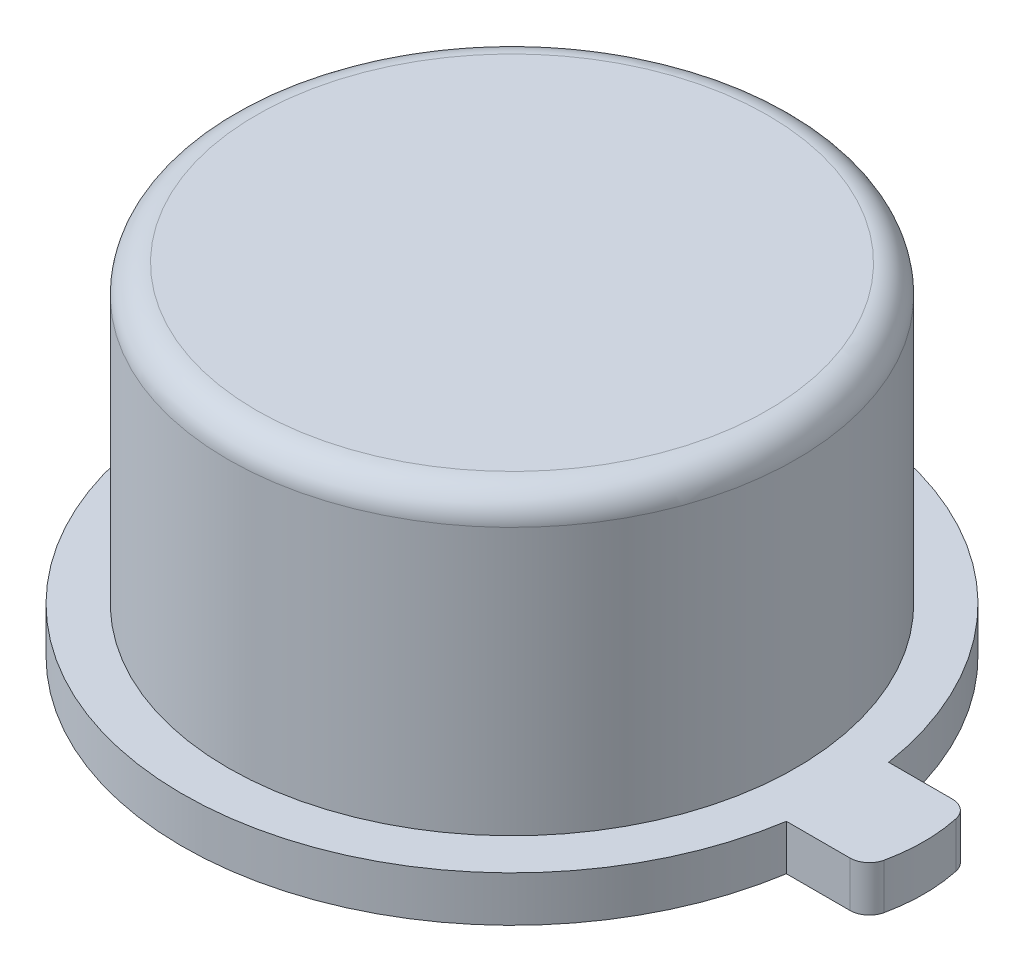
ISO-10303-21;
HEADER;
FILE_DESCRIPTION(('STEP AP214'),'2;1');
FILE_NAME('part.step','',(''),(''),'','','');
FILE_SCHEMA(('AUTOMOTIVE_DESIGN { 1 0 10303 214 1 1 1 1 }'));
ENDSEC;
DATA;
#1=APPLICATION_CONTEXT('core data for automotive mechanical design processes');
#2=APPLICATION_PROTOCOL_DEFINITION('international standard','automotive_design',2000,#1);
#3=PRODUCT_CONTEXT('',#1,'mechanical');
#4=PRODUCT('Part','Part','',(#3));
#5=PRODUCT_RELATED_PRODUCT_CATEGORY('part','',(#4));
#6=PRODUCT_DEFINITION_FORMATION('','',#4);
#7=PRODUCT_DEFINITION_CONTEXT('part definition',#1,'design');
#8=PRODUCT_DEFINITION('design','',#6,#7);
#9=PRODUCT_DEFINITION_SHAPE('','',#8);
#10=(LENGTH_UNIT() NAMED_UNIT(*) SI_UNIT(.MILLI.,.METRE.));
#11=(NAMED_UNIT(*) PLANE_ANGLE_UNIT() SI_UNIT($,.RADIAN.));
#12=(NAMED_UNIT(*) SI_UNIT($,.STERADIAN.) SOLID_ANGLE_UNIT());
#13=UNCERTAINTY_MEASURE_WITH_UNIT(LENGTH_MEASURE(1.E-05),#10,'distance_accuracy_value','');
#14=(GEOMETRIC_REPRESENTATION_CONTEXT(3) GLOBAL_UNCERTAINTY_ASSIGNED_CONTEXT((#13)) GLOBAL_UNIT_ASSIGNED_CONTEXT((#10,
#11,#12)) REPRESENTATION_CONTEXT('',''));
#15=CARTESIAN_POINT('',(0.,0.,0.));
#16=DIRECTION('',(0.,0.,1.));
#17=DIRECTION('',(1.,0.,0.));
#18=AXIS2_PLACEMENT_3D('',#15,#16,#17);
#19=CARTESIAN_POINT('',(0.,5.,0.));
#20=DIRECTION('',(0.,-1.,0.));
#21=DIRECTION('',(0.,0.,-1.));
#22=AXIS2_PLACEMENT_3D('',#19,#20,#21);
#23=CYLINDRICAL_SURFACE('',#22,3.9);
#24=CARTESIAN_POINT('',(0.,0.,0.));
#25=DIRECTION('',(0.,-1.,0.));
#26=DIRECTION('',(0.,0.,-1.));
#27=AXIS2_PLACEMENT_3D('',#24,#25,#26);
#28=CIRCLE('',#27,3.9);
#29=CARTESIAN_POINT('',(0.,0.,-3.9));
#30=VERTEX_POINT('',#29);
#31=EDGE_CURVE('E386',#30,#30,#28,.T.);
#32=ORIENTED_EDGE('',*,*,#31,.T.);
#33=EDGE_LOOP('',(#32));
#34=FACE_BOUND('',#33,.T.);
#35=DIRECTION('',(0.,1.,0.));
#36=VECTOR('',#35,1.);
#37=CARTESIAN_POINT('',(-3.86781592116274,0.6,0.500000000000039));
#38=LINE('',#37,#36);
#39=CARTESIAN_POINT('',(-3.86781592116274,0.6,0.500000000000039));
#40=VERTEX_POINT('',#39);
#41=CARTESIAN_POINT('',(-3.86781592116274,5.,0.500000000000039));
#42=VERTEX_POINT('',#41);
#43=EDGE_CURVE('E380',#40,#42,#38,.T.);
#44=ORIENTED_EDGE('',*,*,#43,.T.);
#45=CARTESIAN_POINT('',(0.,5.,0.));
#46=DIRECTION('',(0.,-1.,0.));
#47=DIRECTION('',(0.,0.,-1.));
#48=AXIS2_PLACEMENT_3D('',#45,#46,#47);
#49=CIRCLE('',#48,3.9);
#50=CARTESIAN_POINT('',(-0.5,5.,3.86781592116274));
#51=VERTEX_POINT('',#50);
#52=EDGE_CURVE('E508',#51,#42,#49,.T.);
#53=ORIENTED_EDGE('',*,*,#52,.F.);
#54=DIRECTION('',(0.,1.,0.));
#55=VECTOR('',#54,1.);
#56=CARTESIAN_POINT('',(-0.5,0.6,3.86781592116274));
#57=LINE('',#56,#55);
#58=CARTESIAN_POINT('',(-0.5,0.6,3.86781592116274));
#59=VERTEX_POINT('',#58);
#60=EDGE_CURVE('E48',#59,#51,#57,.T.);
#61=ORIENTED_EDGE('',*,*,#60,.F.);
#62=CARTESIAN_POINT('',(0.,0.6,0.));
#63=DIRECTION('',(0.,-1.,0.));
#64=DIRECTION('',(0.,0.,1.));
#65=AXIS2_PLACEMENT_3D('',#62,#63,#64);
#66=CIRCLE('',#65,3.9);
#67=CARTESIAN_POINT('',(0.499999999999999,0.6,3.86781592116274));
#68=VERTEX_POINT('',#67);
#69=EDGE_CURVE('E304',#68,#59,#66,.T.);
#70=ORIENTED_EDGE('',*,*,#69,.F.);
#71=DIRECTION('',(0.,1.,0.));
#72=VECTOR('',#71,1.);
#73=CARTESIAN_POINT('',(0.499999999999999,0.6,3.86781592116274));
#74=LINE('',#73,#72);
#75=CARTESIAN_POINT('',(0.499999999999999,5.,3.86781592116274));
#76=VERTEX_POINT('',#75);
#77=EDGE_CURVE('E344',#68,#76,#74,.T.);
#78=ORIENTED_EDGE('',*,*,#77,.T.);
#79=CARTESIAN_POINT('',(3.86781592116274,5.,0.499999999999986));
#80=VERTEX_POINT('',#79);
#81=EDGE_CURVE('E390',#80,#76,#49,.T.);
#82=ORIENTED_EDGE('',*,*,#81,.F.);
#83=DIRECTION('',(0.,1.,0.));
#84=VECTOR('',#83,1.);
#85=CARTESIAN_POINT('',(3.86781592116274,0.6,0.499999999999986));
#86=LINE('',#85,#84);
#87=CARTESIAN_POINT('',(3.86781592116274,0.6,0.499999999999986));
#88=VERTEX_POINT('',#87);
#89=EDGE_CURVE('E353',#88,#80,#86,.T.);
#90=ORIENTED_EDGE('',*,*,#89,.F.);
#91=CARTESIAN_POINT('',(0.,0.6,0.));
#92=DIRECTION('',(0.,-1.,0.));
#93=DIRECTION('',(0.,0.,1.));
#94=AXIS2_PLACEMENT_3D('',#91,#92,#93);
#95=CIRCLE('',#94,3.9);
#96=CARTESIAN_POINT('',(3.86781592116274,0.6,-0.500000000000014));
#97=VERTEX_POINT('',#96);
#98=EDGE_CURVE('E292',#97,#88,#95,.T.);
#99=ORIENTED_EDGE('',*,*,#98,.F.);
#100=DIRECTION('',(0.,1.,0.));
#101=VECTOR('',#100,1.);
#102=CARTESIAN_POINT('',(3.86781592116274,0.6,-0.500000000000014));
#103=LINE('',#102,#101);
#104=CARTESIAN_POINT('',(3.86781592116274,5.,-0.500000000000014));
#105=VERTEX_POINT('',#104);
#106=EDGE_CURVE('E356',#97,#105,#103,.T.);
#107=ORIENTED_EDGE('',*,*,#106,.T.);
#108=CARTESIAN_POINT('',(0.499999999999973,5.,-3.86781592116275));
#109=VERTEX_POINT('',#108);
#110=EDGE_CURVE('E387',#109,#105,#49,.T.);
#111=ORIENTED_EDGE('',*,*,#110,.F.);
#112=DIRECTION('',(0.,1.,0.));
#113=VECTOR('',#112,1.);
#114=CARTESIAN_POINT('',(0.499999999999973,0.6,-3.86781592116275));
#115=LINE('',#114,#113);
#116=CARTESIAN_POINT('',(0.499999999999973,0.6,-3.86781592116275));
#117=VERTEX_POINT('',#116);
#118=EDGE_CURVE('E365',#117,#109,#115,.T.);
#119=ORIENTED_EDGE('',*,*,#118,.F.);
#120=CARTESIAN_POINT('',(0.,0.6,0.));
#121=DIRECTION('',(0.,-1.,0.));
#122=DIRECTION('',(0.,0.,1.));
#123=AXIS2_PLACEMENT_3D('',#120,#121,#122);
#124=CIRCLE('',#123,3.9);
#125=CARTESIAN_POINT('',(-0.500000000000025,0.6,-3.86781592116274));
#126=VERTEX_POINT('',#125);
#127=EDGE_CURVE('E280',#126,#117,#124,.T.);
#128=ORIENTED_EDGE('',*,*,#127,.F.);
#129=DIRECTION('',(0.,1.,0.));
#130=VECTOR('',#129,1.);
#131=CARTESIAN_POINT('',(-0.500000000000025,0.6,-3.86781592116274));
#132=LINE('',#131,#130);
#133=CARTESIAN_POINT('',(-0.500000000000025,5.,-3.86781592116274));
#134=VERTEX_POINT('',#133);
#135=EDGE_CURVE('E368',#126,#134,#132,.T.);
#136=ORIENTED_EDGE('',*,*,#135,.T.);
#137=CARTESIAN_POINT('',(-3.86781592116275,5.,-0.49999999999996));
#138=VERTEX_POINT('',#137);
#139=EDGE_CURVE('E391',#138,#134,#49,.T.);
#140=ORIENTED_EDGE('',*,*,#139,.F.);
#141=DIRECTION('',(0.,1.,0.));
#142=VECTOR('',#141,1.);
#143=CARTESIAN_POINT('',(-3.86781592116275,0.6,-0.49999999999996));
#144=LINE('',#143,#142);
#145=CARTESIAN_POINT('',(-3.86781592116275,0.6,-0.49999999999996));
#146=VERTEX_POINT('',#145);
#147=EDGE_CURVE('E377',#146,#138,#144,.T.);
#148=ORIENTED_EDGE('',*,*,#147,.F.);
#149=CARTESIAN_POINT('',(0.,0.6,0.));
#150=DIRECTION('',(0.,-1.,0.));
#151=DIRECTION('',(0.,0.,1.));
#152=AXIS2_PLACEMENT_3D('',#149,#150,#151);
#153=CIRCLE('',#152,3.9);
#154=EDGE_CURVE('E268',#40,#146,#153,.T.);
#155=ORIENTED_EDGE('',*,*,#154,.F.);
#156=EDGE_LOOP('',(#44,#53,#61,#70,#78,#82,#90,#99,#107,#111,#119,#128,#136,#140,#148,#155));
#157=FACE_BOUND('',#156,.T.);
#158=ADVANCED_FACE('F33',(#34,#157),#23,.F.);
#159=CARTESIAN_POINT('',(0.,5.,0.));
#160=DIRECTION('',(0.,-1.,0.));
#161=DIRECTION('',(0.,0.,-1.));
#162=AXIS2_PLACEMENT_3D('',#159,#160,#161);
#163=PLANE('',#162);
#164=CARTESIAN_POINT('',(0.,5.,0.));
#165=DIRECTION('',(0.,-1.,0.));
#166=DIRECTION('',(0.,0.,-1.));
#167=AXIS2_PLACEMENT_3D('',#164,#165,#166);
#168=CIRCLE('',#167,2.);
#169=CARTESIAN_POINT('',(-1.93649167310371,5.,-0.499999999999979));
#170=VERTEX_POINT('',#169);
#171=CARTESIAN_POINT('',(-0.500000000000014,5.,-1.93649167310371));
#172=VERTEX_POINT('',#171);
#173=EDGE_CURVE('E316',#170,#172,#168,.T.);
#174=ORIENTED_EDGE('',*,*,#173,.F.);
#175=DIRECTION('',(1.,0.,0.));
#176=VECTOR('',#175,1.);
#177=CARTESIAN_POINT('',(-1.93649167310371,5.,-0.49999999999998));
#178=LINE('',#177,#176);
#179=EDGE_CURVE('E313',#138,#170,#178,.T.);
#180=ORIENTED_EDGE('',*,*,#179,.F.);
#181=ORIENTED_EDGE('',*,*,#139,.T.);
#182=DIRECTION('',(0.,0.,-1.));
#183=VECTOR('',#182,1.);
#184=CARTESIAN_POINT('',(-0.500000000000014,5.,-1.93649167310371));
#185=LINE('',#184,#183);
#186=EDGE_CURVE('E319',#172,#134,#185,.T.);
#187=ORIENTED_EDGE('',*,*,#186,.F.);
#188=EDGE_LOOP('',(#174,#180,#181,#187));
#189=FACE_BOUND('',#188,.T.);
#190=ADVANCED_FACE('F176',(#189),#163,.T.);
#191=CARTESIAN_POINT('',(0.,5.,0.));
#192=DIRECTION('',(0.,-1.,0.));
#193=DIRECTION('',(0.,0.,-1.));
#194=AXIS2_PLACEMENT_3D('',#191,#192,#193);
#195=CIRCLE('',#194,2.);
#196=CARTESIAN_POINT('',(0.499999999999986,5.,-1.93649167310371));
#197=VERTEX_POINT('',#196);
#198=CARTESIAN_POINT('',(1.93649167310371,5.,-0.500000000000007));
#199=VERTEX_POINT('',#198);
#200=EDGE_CURVE('E325',#197,#199,#195,.T.);
#201=ORIENTED_EDGE('',*,*,#200,.F.);
#202=DIRECTION('',(0.,0.,1.));
#203=VECTOR('',#202,1.);
#204=CARTESIAN_POINT('',(0.499999999999986,5.,-1.93649167310371));
#205=LINE('',#204,#203);
#206=EDGE_CURVE('E322',#109,#197,#205,.T.);
#207=ORIENTED_EDGE('',*,*,#206,.F.);
#208=ORIENTED_EDGE('',*,*,#110,.T.);
#209=DIRECTION('',(1.,0.,0.));
#210=VECTOR('',#209,1.);
#211=CARTESIAN_POINT('',(1.93649167310371,5.,-0.500000000000007));
#212=LINE('',#211,#210);
#213=EDGE_CURVE('E328',#199,#105,#212,.T.);
#214=ORIENTED_EDGE('',*,*,#213,.F.);
#215=EDGE_LOOP('',(#201,#207,#208,#214));
#216=FACE_BOUND('',#215,.T.);
#217=ADVANCED_FACE('F181',(#216),#163,.T.);
#218=CARTESIAN_POINT('',(0.,5.,0.));
#219=DIRECTION('',(0.,-1.,0.));
#220=DIRECTION('',(0.,0.,-1.));
#221=AXIS2_PLACEMENT_3D('',#218,#219,#220);
#222=CIRCLE('',#221,2.);
#223=CARTESIAN_POINT('',(1.93649167310371,5.,0.499999999999993));
#224=VERTEX_POINT('',#223);
#225=CARTESIAN_POINT('',(0.5,5.,1.93649167310371));
#226=VERTEX_POINT('',#225);
#227=EDGE_CURVE('E334',#224,#226,#222,.T.);
#228=ORIENTED_EDGE('',*,*,#227,.F.);
#229=DIRECTION('',(-1.,0.,0.));
#230=VECTOR('',#229,1.);
#231=CARTESIAN_POINT('',(1.93649167310371,5.,0.499999999999993));
#232=LINE('',#231,#230);
#233=EDGE_CURVE('E331',#80,#224,#232,.T.);
#234=ORIENTED_EDGE('',*,*,#233,.F.);
#235=ORIENTED_EDGE('',*,*,#81,.T.);
#236=DIRECTION('',(0.,0.,1.));
#237=VECTOR('',#236,1.);
#238=CARTESIAN_POINT('',(0.5,5.,1.93649167310371));
#239=LINE('',#238,#237);
#240=EDGE_CURVE('E337',#226,#76,#239,.T.);
#241=ORIENTED_EDGE('',*,*,#240,.F.);
#242=EDGE_LOOP('',(#228,#234,#235,#241));
#243=FACE_BOUND('',#242,.T.);
#244=ADVANCED_FACE('F248',(#243),#163,.T.);
#245=CARTESIAN_POINT('',(0.,0.8,0.));
#246=DIRECTION('',(0.,1.,0.));
#247=DIRECTION('',(0.,0.,1.));
#248=AXIS2_PLACEMENT_3D('',#245,#246,#247);
#249=PLANE('',#248);
#250=CARTESIAN_POINT('',(0.,0.8,0.));
#251=DIRECTION('',(0.,1.,0.));
#252=DIRECTION('',(0.,0.,1.));
#253=AXIS2_PLACEMENT_3D('',#250,#251,#252);
#254=CIRCLE('',#253,5.8);
#255=CARTESIAN_POINT('',(5.72974694031072,0.8,-0.9));
#256=VERTEX_POINT('',#255);
#257=CARTESIAN_POINT('',(5.72974694031072,0.8,0.9));
#258=VERTEX_POINT('',#257);
#259=EDGE_CURVE('E144',#256,#258,#254,.T.);
#260=ORIENTED_EDGE('',*,*,#259,.T.);
#261=DIRECTION('',(1.,0.,0.));
#262=VECTOR('',#261,1.);
#263=CARTESIAN_POINT('',(5.72974694031072,0.8,0.9));
#264=LINE('',#263,#262);
#265=CARTESIAN_POINT('',(6.85,0.8,0.9));
#266=VERTEX_POINT('',#265);
#267=EDGE_CURVE('E93',#258,#266,#264,.T.);
#268=ORIENTED_EDGE('',*,*,#267,.T.);
#269=CARTESIAN_POINT('',(6.85,0.8,0.55952380952381));
#270=DIRECTION('',(0.,1.,0.));
#271=DIRECTION('',(0.,0.,1.));
#272=AXIS2_PLACEMENT_3D('',#269,#270,#271);
#273=CIRCLE('',#272,0.34047619047619);
#274=CARTESIAN_POINT('',(7.18285586392122,0.8,0.631154879140555));
#275=VERTEX_POINT('',#274);
#276=EDGE_CURVE('E111',#266,#275,#273,.T.);
#277=ORIENTED_EDGE('',*,*,#276,.T.);
#278=CARTESIAN_POINT('',(4.25,0.8,0.));
#279=DIRECTION('',(0.,1.,0.));
#280=DIRECTION('',(0.,0.,-1.));
#281=AXIS2_PLACEMENT_3D('',#278,#279,#280);
#282=CIRCLE('',#281,3.);
#283=CARTESIAN_POINT('',(7.18285586392122,0.8,-0.631154879140554));
#284=VERTEX_POINT('',#283);
#285=EDGE_CURVE('E103',#275,#284,#282,.T.);
#286=ORIENTED_EDGE('',*,*,#285,.T.);
#287=CARTESIAN_POINT('',(6.85,0.8,-0.559523809523809));
#288=DIRECTION('',(0.,1.,0.));
#289=DIRECTION('',(0.,0.,-1.));
#290=AXIS2_PLACEMENT_3D('',#287,#288,#289);
#291=CIRCLE('',#290,0.34047619047619);
#292=CARTESIAN_POINT('',(6.85,0.8,-0.9));
#293=VERTEX_POINT('',#292);
#294=EDGE_CURVE('E108',#284,#293,#291,.T.);
#295=ORIENTED_EDGE('',*,*,#294,.T.);
#296=DIRECTION('',(-1.,0.,0.));
#297=VECTOR('',#296,1.);
#298=CARTESIAN_POINT('',(5.72974694031072,0.8,-0.9));
#299=LINE('',#298,#297);
#300=EDGE_CURVE('E57',#293,#256,#299,.T.);
#301=ORIENTED_EDGE('',*,*,#300,.T.);
#302=EDGE_LOOP('',(#260,#268,#277,#286,#295,#301));
#303=FACE_BOUND('',#302,.T.);
#304=CARTESIAN_POINT('',(0.,0.8,0.));
#305=DIRECTION('',(0.,1.,0.));
#306=DIRECTION('',(0.,0.,1.));
#307=AXIS2_PLACEMENT_3D('',#304,#305,#306);
#308=CIRCLE('',#307,5.);
#309=CARTESIAN_POINT('',(0.,0.8,5.));
#310=VERTEX_POINT('',#309);
#311=EDGE_CURVE('E136',#310,#310,#308,.T.);
#312=ORIENTED_EDGE('',*,*,#311,.F.);
#313=EDGE_LOOP('',(#312));
#314=FACE_BOUND('',#313,.T.);
#315=ADVANCED_FACE('F105',(#303,#314),#249,.T.);
#316=CARTESIAN_POINT('',(0.,0.,0.));
#317=DIRECTION('',(0.,1.,0.));
#318=DIRECTION('',(0.,0.,1.));
#319=AXIS2_PLACEMENT_3D('',#316,#317,#318);
#320=PLANE('',#319);
#321=ORIENTED_EDGE('',*,*,#31,.F.);
#322=EDGE_LOOP('',(#321));
#323=FACE_BOUND('',#322,.T.);
#324=CARTESIAN_POINT('',(0.,0.,0.));
#325=DIRECTION('',(0.,1.,0.));
#326=DIRECTION('',(0.,0.,1.));
#327=AXIS2_PLACEMENT_3D('',#324,#325,#326);
#328=CIRCLE('',#327,5.8);
#329=CARTESIAN_POINT('',(5.72974694031072,0.,-0.9));
#330=VERTEX_POINT('',#329);
#331=CARTESIAN_POINT('',(5.72974694031072,0.,0.9));
#332=VERTEX_POINT('',#331);
#333=EDGE_CURVE('E132',#330,#332,#328,.T.);
#334=ORIENTED_EDGE('',*,*,#333,.F.);
#335=DIRECTION('',(-1.,0.,0.));
#336=VECTOR('',#335,1.);
#337=CARTESIAN_POINT('',(5.72974694031072,0.,-0.9));
#338=LINE('',#337,#336);
#339=CARTESIAN_POINT('',(6.85,0.,-0.9));
#340=VERTEX_POINT('',#339);
#341=EDGE_CURVE('E84',#340,#330,#338,.T.);
#342=ORIENTED_EDGE('',*,*,#341,.F.);
#343=CARTESIAN_POINT('',(6.85,0.,-0.559523809523809));
#344=DIRECTION('',(0.,1.,0.));
#345=DIRECTION('',(0.,0.,-1.));
#346=AXIS2_PLACEMENT_3D('',#343,#344,#345);
#347=CIRCLE('',#346,0.34047619047619);
#348=CARTESIAN_POINT('',(7.18285586392122,0.,-0.631154879140554));
#349=VERTEX_POINT('',#348);
#350=EDGE_CURVE('E141',#349,#340,#347,.T.);
#351=ORIENTED_EDGE('',*,*,#350,.F.);
#352=CARTESIAN_POINT('',(4.25,0.,0.));
#353=DIRECTION('',(0.,1.,0.));
#354=DIRECTION('',(0.,0.,-1.));
#355=AXIS2_PLACEMENT_3D('',#352,#353,#354);
#356=CIRCLE('',#355,3.);
#357=CARTESIAN_POINT('',(7.18285586392122,0.,0.631154879140555));
#358=VERTEX_POINT('',#357);
#359=EDGE_CURVE('E120',#358,#349,#356,.T.);
#360=ORIENTED_EDGE('',*,*,#359,.F.);
#361=CARTESIAN_POINT('',(6.85,0.,0.55952380952381));
#362=DIRECTION('',(0.,1.,0.));
#363=DIRECTION('',(0.,0.,1.));
#364=AXIS2_PLACEMENT_3D('',#361,#362,#363);
#365=CIRCLE('',#364,0.34047619047619);
#366=CARTESIAN_POINT('',(6.85,0.,0.9));
#367=VERTEX_POINT('',#366);
#368=EDGE_CURVE('E138',#367,#358,#365,.T.);
#369=ORIENTED_EDGE('',*,*,#368,.F.);
#370=DIRECTION('',(1.,0.,0.));
#371=VECTOR('',#370,1.);
#372=CARTESIAN_POINT('',(5.72974694031072,0.,0.9));
#373=LINE('',#372,#371);
#374=EDGE_CURVE('E135',#332,#367,#373,.T.);
#375=ORIENTED_EDGE('',*,*,#374,.F.);
#376=EDGE_LOOP('',(#334,#342,#351,#360,#369,#375));
#377=FACE_BOUND('',#376,.T.);
#378=ADVANCED_FACE('F404',(#323,#377),#320,.F.);
#379=CARTESIAN_POINT('',(0.,0.8,0.));
#380=DIRECTION('',(0.,-1.,0.));
#381=DIRECTION('',(0.,0.,-1.));
#382=AXIS2_PLACEMENT_3D('',#379,#380,#381);
#383=CYLINDRICAL_SURFACE('',#382,5.8);
#384=ORIENTED_EDGE('',*,*,#333,.T.);
#385=DIRECTION('',(0.,-1.,0.));
#386=VECTOR('',#385,1.);
#387=CARTESIAN_POINT('',(5.72974694031072,0.8,0.9));
#388=LINE('',#387,#386);
#389=EDGE_CURVE('E151',#258,#332,#388,.T.);
#390=ORIENTED_EDGE('',*,*,#389,.F.);
#391=ORIENTED_EDGE('',*,*,#259,.F.);
#392=DIRECTION('',(0.,-1.,0.));
#393=VECTOR('',#392,1.);
#394=CARTESIAN_POINT('',(5.72974694031072,0.8,-0.9));
#395=LINE('',#394,#393);
#396=EDGE_CURVE('E128',#256,#330,#395,.T.);
#397=ORIENTED_EDGE('',*,*,#396,.T.);
#398=EDGE_LOOP('',(#384,#390,#391,#397));
#399=FACE_BOUND('',#398,.T.);
#400=ADVANCED_FACE('F406',(#399),#383,.T.);
#401=CARTESIAN_POINT('',(5.72974694031072,0.8,0.9));
#402=DIRECTION('',(0.,0.,-1.));
#403=DIRECTION('',(-1.,0.,0.));
#404=AXIS2_PLACEMENT_3D('',#401,#402,#403);
#405=PLANE('',#404);
#406=ORIENTED_EDGE('',*,*,#374,.T.);
#407=DIRECTION('',(0.,-1.,0.));
#408=VECTOR('',#407,1.);
#409=CARTESIAN_POINT('',(6.85,0.8,0.9));
#410=LINE('',#409,#408);
#411=EDGE_CURVE('E148',#266,#367,#410,.T.);
#412=ORIENTED_EDGE('',*,*,#411,.F.);
#413=ORIENTED_EDGE('',*,*,#267,.F.);
#414=ORIENTED_EDGE('',*,*,#389,.T.);
#415=EDGE_LOOP('',(#406,#412,#413,#414));
#416=FACE_BOUND('',#415,.T.);
#417=ADVANCED_FACE('F398',(#416),#405,.F.);
#418=CARTESIAN_POINT('',(6.85,0.8,0.55952380952381));
#419=DIRECTION('',(0.,-1.,0.));
#420=DIRECTION('',(0.,0.,-1.));
#421=AXIS2_PLACEMENT_3D('',#418,#419,#420);
#422=CYLINDRICAL_SURFACE('',#421,0.34047619047619);
#423=ORIENTED_EDGE('',*,*,#368,.T.);
#424=DIRECTION('',(0.,-1.,0.));
#425=VECTOR('',#424,1.);
#426=CARTESIAN_POINT('',(7.18285586392122,0.8,0.631154879140555));
#427=LINE('',#426,#425);
#428=EDGE_CURVE('E123',#275,#358,#427,.T.);
#429=ORIENTED_EDGE('',*,*,#428,.F.);
#430=ORIENTED_EDGE('',*,*,#276,.F.);
#431=ORIENTED_EDGE('',*,*,#411,.T.);
#432=EDGE_LOOP('',(#423,#429,#430,#431));
#433=FACE_BOUND('',#432,.T.);
#434=ADVANCED_FACE('F401',(#433),#422,.T.);
#435=CARTESIAN_POINT('',(4.25,0.8,0.));
#436=DIRECTION('',(0.,-1.,0.));
#437=DIRECTION('',(0.,0.,-1.));
#438=AXIS2_PLACEMENT_3D('',#435,#436,#437);
#439=CYLINDRICAL_SURFACE('',#438,3.);
#440=ORIENTED_EDGE('',*,*,#359,.T.);
#441=DIRECTION('',(0.,-1.,0.));
#442=VECTOR('',#441,1.);
#443=CARTESIAN_POINT('',(7.18285586392122,0.8,-0.631154879140554));
#444=LINE('',#443,#442);
#445=EDGE_CURVE('E117',#284,#349,#444,.T.);
#446=ORIENTED_EDGE('',*,*,#445,.F.);
#447=ORIENTED_EDGE('',*,*,#285,.F.);
#448=ORIENTED_EDGE('',*,*,#428,.T.);
#449=EDGE_LOOP('',(#440,#446,#447,#448));
#450=FACE_BOUND('',#449,.T.);
#451=ADVANCED_FACE('F118',(#450),#439,.T.);
#452=CARTESIAN_POINT('',(6.85,0.8,-0.559523809523809));
#453=DIRECTION('',(0.,-1.,0.));
#454=DIRECTION('',(0.,0.,-1.));
#455=AXIS2_PLACEMENT_3D('',#452,#453,#454);
#456=CYLINDRICAL_SURFACE('',#455,0.34047619047619);
#457=ORIENTED_EDGE('',*,*,#350,.T.);
#458=DIRECTION('',(0.,-1.,0.));
#459=VECTOR('',#458,1.);
#460=CARTESIAN_POINT('',(6.85,0.8,-0.9));
#461=LINE('',#460,#459);
#462=EDGE_CURVE('E124',#293,#340,#461,.T.);
#463=ORIENTED_EDGE('',*,*,#462,.F.);
#464=ORIENTED_EDGE('',*,*,#294,.F.);
#465=ORIENTED_EDGE('',*,*,#445,.T.);
#466=EDGE_LOOP('',(#457,#463,#464,#465));
#467=FACE_BOUND('',#466,.T.);
#468=ADVANCED_FACE('F126',(#467),#456,.T.);
#469=CARTESIAN_POINT('',(5.72974694031072,0.8,-0.9));
#470=DIRECTION('',(0.,0.,1.));
#471=DIRECTION('',(1.,0.,0.));
#472=AXIS2_PLACEMENT_3D('',#469,#470,#471);
#473=PLANE('',#472);
#474=ORIENTED_EDGE('',*,*,#341,.T.);
#475=ORIENTED_EDGE('',*,*,#396,.F.);
#476=ORIENTED_EDGE('',*,*,#300,.F.);
#477=ORIENTED_EDGE('',*,*,#462,.T.);
#478=EDGE_LOOP('',(#474,#475,#476,#477));
#479=FACE_BOUND('',#478,.T.);
#480=ADVANCED_FACE('F172',(#479),#473,.F.);
#481=CARTESIAN_POINT('',(0.,6.,0.));
#482=DIRECTION('',(0.,-1.,0.));
#483=DIRECTION('',(0.,0.,-1.));
#484=AXIS2_PLACEMENT_3D('',#481,#482,#483);
#485=CYLINDRICAL_SURFACE('',#484,5.);
#486=CARTESIAN_POINT('',(0.,5.5,0.));
#487=DIRECTION('',(0.,1.,0.));
#488=DIRECTION('',(0.,0.,1.));
#489=AXIS2_PLACEMENT_3D('',#486,#487,#488);
#490=CIRCLE('',#489,5.);
#491=CARTESIAN_POINT('',(0.,5.5,5.));
#492=VERTEX_POINT('',#491);
#493=EDGE_CURVE('E41',#492,#492,#490,.F.);
#494=ORIENTED_EDGE('',*,*,#493,.T.);
#495=EDGE_LOOP('',(#494));
#496=FACE_BOUND('',#495,.T.);
#497=ORIENTED_EDGE('',*,*,#311,.T.);
#498=EDGE_LOOP('',(#497));
#499=FACE_BOUND('',#498,.T.);
#500=ADVANCED_FACE('F158',(#496,#499),#485,.T.);
#501=CARTESIAN_POINT('',(0.,6.,0.));
#502=DIRECTION('',(0.,1.,0.));
#503=DIRECTION('',(0.,0.,1.));
#504=AXIS2_PLACEMENT_3D('',#501,#502,#503);
#505=PLANE('',#504);
#506=CARTESIAN_POINT('',(0.,6.,0.));
#507=DIRECTION('',(0.,1.,0.));
#508=DIRECTION('',(0.,0.,1.));
#509=AXIS2_PLACEMENT_3D('',#506,#507,#508);
#510=CIRCLE('',#509,4.5);
#511=CARTESIAN_POINT('',(0.,6.,4.5));
#512=VERTEX_POINT('',#511);
#513=EDGE_CURVE('E153',#512,#512,#510,.T.);
#514=ORIENTED_EDGE('',*,*,#513,.T.);
#515=EDGE_LOOP('',(#514));
#516=FACE_BOUND('',#515,.T.);
#517=ADVANCED_FACE('F164',(#516),#505,.T.);
#518=CARTESIAN_POINT('',(0.,5.5,0.));
#519=DIRECTION('',(0.,1.,0.));
#520=DIRECTION('',(0.,0.,1.));
#521=AXIS2_PLACEMENT_3D('',#518,#519,#520);
#522=TOROIDAL_SURFACE('',#521,4.5,0.5);
#523=ORIENTED_EDGE('',*,*,#493,.F.);
#524=EDGE_LOOP('',(#523));
#525=FACE_BOUND('',#524,.T.);
#526=ORIENTED_EDGE('',*,*,#513,.F.);
#527=EDGE_LOOP('',(#526));
#528=FACE_BOUND('',#527,.T.);
#529=ADVANCED_FACE('F35',(#525,#528),#522,.T.);
#530=ORIENTED_EDGE('',*,*,#52,.T.);
#531=DIRECTION('',(-1.,0.,0.));
#532=VECTOR('',#531,1.);
#533=CARTESIAN_POINT('',(-1.9364916731037,5.,0.50000000000002));
#534=LINE('',#533,#532);
#535=CARTESIAN_POINT('',(-1.9364916731037,5.,0.50000000000002));
#536=VERTEX_POINT('',#535);
#537=EDGE_CURVE('E258',#536,#42,#534,.T.);
#538=ORIENTED_EDGE('',*,*,#537,.F.);
#539=CARTESIAN_POINT('',(0.,5.,0.));
#540=DIRECTION('',(0.,-1.,0.));
#541=DIRECTION('',(0.,0.,-1.));
#542=AXIS2_PLACEMENT_3D('',#539,#540,#541);
#543=CIRCLE('',#542,2.);
#544=CARTESIAN_POINT('',(-0.5,5.,1.93649167310371));
#545=VERTEX_POINT('',#544);
#546=EDGE_CURVE('E255',#545,#536,#543,.T.);
#547=ORIENTED_EDGE('',*,*,#546,.F.);
#548=DIRECTION('',(0.,0.,-1.));
#549=VECTOR('',#548,1.);
#550=CARTESIAN_POINT('',(-0.5,5.,1.93649167310371));
#551=LINE('',#550,#549);
#552=EDGE_CURVE('E265',#51,#545,#551,.T.);
#553=ORIENTED_EDGE('',*,*,#552,.F.);
#554=EDGE_LOOP('',(#530,#538,#547,#553));
#555=FACE_BOUND('',#554,.T.);
#556=ADVANCED_FACE('F163',(#555),#163,.T.);
#557=CARTESIAN_POINT('',(0.,0.6,0.));
#558=DIRECTION('',(0.,-1.,0.));
#559=DIRECTION('',(0.,0.,-1.));
#560=AXIS2_PLACEMENT_3D('',#557,#558,#559);
#561=PLANE('',#560);
#562=CARTESIAN_POINT('',(0.,0.6,0.));
#563=DIRECTION('',(0.,-1.,0.));
#564=DIRECTION('',(0.,0.,-1.));
#565=AXIS2_PLACEMENT_3D('',#562,#563,#564);
#566=CIRCLE('',#565,2.);
#567=CARTESIAN_POINT('',(-0.5,0.6,1.93649167310371));
#568=VERTEX_POINT('',#567);
#569=CARTESIAN_POINT('',(-1.9364916731037,0.6,0.50000000000002));
#570=VERTEX_POINT('',#569);
#571=EDGE_CURVE('E261',#568,#570,#566,.T.);
#572=ORIENTED_EDGE('',*,*,#571,.T.);
#573=DIRECTION('',(-1.,0.,0.));
#574=VECTOR('',#573,1.);
#575=CARTESIAN_POINT('',(-1.9364916731037,0.6,0.50000000000002));
#576=LINE('',#575,#574);
#577=EDGE_CURVE('E264',#570,#40,#576,.T.);
#578=ORIENTED_EDGE('',*,*,#577,.T.);
#579=ORIENTED_EDGE('',*,*,#154,.T.);
#580=DIRECTION('',(1.,0.,0.));
#581=VECTOR('',#580,1.);
#582=CARTESIAN_POINT('',(-1.93649167310371,0.6,-0.49999999999998));
#583=LINE('',#582,#581);
#584=CARTESIAN_POINT('',(-1.93649167310371,0.6,-0.499999999999979));
#585=VERTEX_POINT('',#584);
#586=EDGE_CURVE('E271',#146,#585,#583,.T.);
#587=ORIENTED_EDGE('',*,*,#586,.T.);
#588=CARTESIAN_POINT('',(0.,0.6,0.));
#589=DIRECTION('',(0.,-1.,0.));
#590=DIRECTION('',(0.,0.,-1.));
#591=AXIS2_PLACEMENT_3D('',#588,#589,#590);
#592=CIRCLE('',#591,2.);
#593=CARTESIAN_POINT('',(-0.500000000000014,0.6,-1.93649167310371));
#594=VERTEX_POINT('',#593);
#595=EDGE_CURVE('E274',#585,#594,#592,.T.);
#596=ORIENTED_EDGE('',*,*,#595,.T.);
#597=DIRECTION('',(0.,0.,-1.));
#598=VECTOR('',#597,1.);
#599=CARTESIAN_POINT('',(-0.500000000000014,0.6,-1.93649167310371));
#600=LINE('',#599,#598);
#601=EDGE_CURVE('E277',#594,#126,#600,.T.);
#602=ORIENTED_EDGE('',*,*,#601,.T.);
#603=ORIENTED_EDGE('',*,*,#127,.T.);
#604=DIRECTION('',(0.,0.,1.));
#605=VECTOR('',#604,1.);
#606=CARTESIAN_POINT('',(0.499999999999986,0.6,-1.93649167310371));
#607=LINE('',#606,#605);
#608=CARTESIAN_POINT('',(0.499999999999986,0.6,-1.93649167310371));
#609=VERTEX_POINT('',#608);
#610=EDGE_CURVE('E283',#117,#609,#607,.T.);
#611=ORIENTED_EDGE('',*,*,#610,.T.);
#612=CARTESIAN_POINT('',(0.,0.6,0.));
#613=DIRECTION('',(0.,-1.,0.));
#614=DIRECTION('',(0.,0.,-1.));
#615=AXIS2_PLACEMENT_3D('',#612,#613,#614);
#616=CIRCLE('',#615,2.);
#617=CARTESIAN_POINT('',(1.93649167310371,0.6,-0.500000000000007));
#618=VERTEX_POINT('',#617);
#619=EDGE_CURVE('E286',#609,#618,#616,.T.);
#620=ORIENTED_EDGE('',*,*,#619,.T.);
#621=DIRECTION('',(1.,0.,0.));
#622=VECTOR('',#621,1.);
#623=CARTESIAN_POINT('',(1.93649167310371,0.6,-0.500000000000007));
#624=LINE('',#623,#622);
#625=EDGE_CURVE('E289',#618,#97,#624,.T.);
#626=ORIENTED_EDGE('',*,*,#625,.T.);
#627=ORIENTED_EDGE('',*,*,#98,.T.);
#628=DIRECTION('',(-1.,0.,0.));
#629=VECTOR('',#628,1.);
#630=CARTESIAN_POINT('',(1.93649167310371,0.6,0.499999999999993));
#631=LINE('',#630,#629);
#632=CARTESIAN_POINT('',(1.93649167310371,0.6,0.499999999999993));
#633=VERTEX_POINT('',#632);
#634=EDGE_CURVE('E295',#88,#633,#631,.T.);
#635=ORIENTED_EDGE('',*,*,#634,.T.);
#636=CARTESIAN_POINT('',(0.,0.6,0.));
#637=DIRECTION('',(0.,-1.,0.));
#638=DIRECTION('',(0.,0.,-1.));
#639=AXIS2_PLACEMENT_3D('',#636,#637,#638);
#640=CIRCLE('',#639,2.);
#641=CARTESIAN_POINT('',(0.5,0.6,1.93649167310371));
#642=VERTEX_POINT('',#641);
#643=EDGE_CURVE('E298',#633,#642,#640,.T.);
#644=ORIENTED_EDGE('',*,*,#643,.T.);
#645=DIRECTION('',(0.,0.,1.));
#646=VECTOR('',#645,1.);
#647=CARTESIAN_POINT('',(0.5,0.6,1.93649167310371));
#648=LINE('',#647,#646);
#649=EDGE_CURVE('E301',#642,#68,#648,.T.);
#650=ORIENTED_EDGE('',*,*,#649,.T.);
#651=ORIENTED_EDGE('',*,*,#69,.T.);
#652=DIRECTION('',(0.,0.,-1.));
#653=VECTOR('',#652,1.);
#654=CARTESIAN_POINT('',(-0.5,0.6,1.93649167310371));
#655=LINE('',#654,#653);
#656=EDGE_CURVE('E307',#59,#568,#655,.T.);
#657=ORIENTED_EDGE('',*,*,#656,.T.);
#658=EDGE_LOOP('',(#572,#578,#579,#587,#596,#602,#603,#611,#620,#626,#627,#635,#644,#650,#651,#657));
#659=FACE_BOUND('',#658,.T.);
#660=CARTESIAN_POINT('',(0.,0.6,0.));
#661=DIRECTION('',(0.,-1.,0.));
#662=DIRECTION('',(0.,0.,-1.));
#663=AXIS2_PLACEMENT_3D('',#660,#661,#662);
#664=CIRCLE('',#663,0.85);
#665=CARTESIAN_POINT('',(0.,0.6,-0.85));
#666=VERTEX_POINT('',#665);
#667=EDGE_CURVE('E252',#666,#666,#664,.T.);
#668=ORIENTED_EDGE('',*,*,#667,.F.);
#669=EDGE_LOOP('',(#668));
#670=FACE_BOUND('',#669,.T.);
#671=ADVANCED_FACE('F188',(#659,#670),#561,.T.);
#672=CARTESIAN_POINT('',(0.,0.6,0.));
#673=DIRECTION('',(0.,1.,0.));
#674=DIRECTION('',(0.,0.,1.));
#675=AXIS2_PLACEMENT_3D('',#672,#673,#674);
#676=CYLINDRICAL_SURFACE('',#675,2.);
#677=ORIENTED_EDGE('',*,*,#546,.T.);
#678=DIRECTION('',(0.,1.,0.));
#679=VECTOR('',#678,1.);
#680=CARTESIAN_POINT('',(-1.9364916731037,0.6,0.50000000000002));
#681=LINE('',#680,#679);
#682=EDGE_CURVE('E383',#570,#536,#681,.T.);
#683=ORIENTED_EDGE('',*,*,#682,.F.);
#684=ORIENTED_EDGE('',*,*,#571,.F.);
#685=DIRECTION('',(0.,1.,0.));
#686=VECTOR('',#685,1.);
#687=CARTESIAN_POINT('',(-0.5,0.6,1.93649167310371));
#688=LINE('',#687,#686);
#689=EDGE_CURVE('E309',#568,#545,#688,.T.);
#690=ORIENTED_EDGE('',*,*,#689,.T.);
#691=EDGE_LOOP('',(#677,#683,#684,#690));
#692=FACE_BOUND('',#691,.T.);
#693=ADVANCED_FACE('F191',(#692),#676,.T.);
#694=CARTESIAN_POINT('',(-1.9364916731037,0.6,0.50000000000002));
#695=DIRECTION('',(0.,0.,-1.));
#696=DIRECTION('',(-1.,0.,0.));
#697=AXIS2_PLACEMENT_3D('',#694,#695,#696);
#698=PLANE('',#697);
#699=ORIENTED_EDGE('',*,*,#537,.T.);
#700=ORIENTED_EDGE('',*,*,#43,.F.);
#701=ORIENTED_EDGE('',*,*,#577,.F.);
#702=ORIENTED_EDGE('',*,*,#682,.T.);
#703=EDGE_LOOP('',(#699,#700,#701,#702));
#704=FACE_BOUND('',#703,.T.);
#705=ADVANCED_FACE('F194',(#704),#698,.F.);
#706=CARTESIAN_POINT('',(-1.93649167310371,0.6,-0.49999999999998));
#707=DIRECTION('',(0.,0.,1.));
#708=DIRECTION('',(1.,0.,0.));
#709=AXIS2_PLACEMENT_3D('',#706,#707,#708);
#710=PLANE('',#709);
#711=ORIENTED_EDGE('',*,*,#179,.T.);
#712=DIRECTION('',(0.,1.,0.));
#713=VECTOR('',#712,1.);
#714=CARTESIAN_POINT('',(-1.93649167310371,0.6,-0.499999999999979));
#715=LINE('',#714,#713);
#716=EDGE_CURVE('E374',#585,#170,#715,.T.);
#717=ORIENTED_EDGE('',*,*,#716,.F.);
#718=ORIENTED_EDGE('',*,*,#586,.F.);
#719=ORIENTED_EDGE('',*,*,#147,.T.);
#720=EDGE_LOOP('',(#711,#717,#718,#719));
#721=FACE_BOUND('',#720,.T.);
#722=ADVANCED_FACE('F198',(#721),#710,.F.);
#723=CARTESIAN_POINT('',(0.,0.6,0.));
#724=DIRECTION('',(0.,1.,0.));
#725=DIRECTION('',(0.,0.,1.));
#726=AXIS2_PLACEMENT_3D('',#723,#724,#725);
#727=CYLINDRICAL_SURFACE('',#726,2.);
#728=ORIENTED_EDGE('',*,*,#173,.T.);
#729=DIRECTION('',(0.,1.,0.));
#730=VECTOR('',#729,1.);
#731=CARTESIAN_POINT('',(-0.500000000000014,0.6,-1.93649167310371));
#732=LINE('',#731,#730);
#733=EDGE_CURVE('E371',#594,#172,#732,.T.);
#734=ORIENTED_EDGE('',*,*,#733,.F.);
#735=ORIENTED_EDGE('',*,*,#595,.F.);
#736=ORIENTED_EDGE('',*,*,#716,.T.);
#737=EDGE_LOOP('',(#728,#734,#735,#736));
#738=FACE_BOUND('',#737,.T.);
#739=ADVANCED_FACE('F202',(#738),#727,.T.);
#740=CARTESIAN_POINT('',(-0.500000000000014,0.6,-1.93649167310371));
#741=DIRECTION('',(1.,0.,0.));
#742=DIRECTION('',(0.,0.,-1.));
#743=AXIS2_PLACEMENT_3D('',#740,#741,#742);
#744=PLANE('',#743);
#745=ORIENTED_EDGE('',*,*,#186,.T.);
#746=ORIENTED_EDGE('',*,*,#135,.F.);
#747=ORIENTED_EDGE('',*,*,#601,.F.);
#748=ORIENTED_EDGE('',*,*,#733,.T.);
#749=EDGE_LOOP('',(#745,#746,#747,#748));
#750=FACE_BOUND('',#749,.T.);
#751=ADVANCED_FACE('F206',(#750),#744,.F.);
#752=CARTESIAN_POINT('',(0.499999999999986,0.6,-1.93649167310371));
#753=DIRECTION('',(-1.,0.,0.));
#754=DIRECTION('',(0.,0.,1.));
#755=AXIS2_PLACEMENT_3D('',#752,#753,#754);
#756=PLANE('',#755);
#757=ORIENTED_EDGE('',*,*,#206,.T.);
#758=DIRECTION('',(0.,1.,0.));
#759=VECTOR('',#758,1.);
#760=CARTESIAN_POINT('',(0.499999999999986,0.6,-1.93649167310371));
#761=LINE('',#760,#759);
#762=EDGE_CURVE('E362',#609,#197,#761,.T.);
#763=ORIENTED_EDGE('',*,*,#762,.F.);
#764=ORIENTED_EDGE('',*,*,#610,.F.);
#765=ORIENTED_EDGE('',*,*,#118,.T.);
#766=EDGE_LOOP('',(#757,#763,#764,#765));
#767=FACE_BOUND('',#766,.T.);
#768=ADVANCED_FACE('F210',(#767),#756,.F.);
#769=CARTESIAN_POINT('',(0.,0.6,0.));
#770=DIRECTION('',(0.,1.,0.));
#771=DIRECTION('',(0.,0.,1.));
#772=AXIS2_PLACEMENT_3D('',#769,#770,#771);
#773=CYLINDRICAL_SURFACE('',#772,2.);
#774=ORIENTED_EDGE('',*,*,#200,.T.);
#775=DIRECTION('',(0.,1.,0.));
#776=VECTOR('',#775,1.);
#777=CARTESIAN_POINT('',(1.93649167310371,0.6,-0.500000000000007));
#778=LINE('',#777,#776);
#779=EDGE_CURVE('E359',#618,#199,#778,.T.);
#780=ORIENTED_EDGE('',*,*,#779,.F.);
#781=ORIENTED_EDGE('',*,*,#619,.F.);
#782=ORIENTED_EDGE('',*,*,#762,.T.);
#783=EDGE_LOOP('',(#774,#780,#781,#782));
#784=FACE_BOUND('',#783,.T.);
#785=ADVANCED_FACE('F214',(#784),#773,.T.);
#786=CARTESIAN_POINT('',(1.93649167310371,0.6,-0.500000000000007));
#787=DIRECTION('',(0.,0.,1.));
#788=DIRECTION('',(1.,0.,0.));
#789=AXIS2_PLACEMENT_3D('',#786,#787,#788);
#790=PLANE('',#789);
#791=ORIENTED_EDGE('',*,*,#213,.T.);
#792=ORIENTED_EDGE('',*,*,#106,.F.);
#793=ORIENTED_EDGE('',*,*,#625,.F.);
#794=ORIENTED_EDGE('',*,*,#779,.T.);
#795=EDGE_LOOP('',(#791,#792,#793,#794));
#796=FACE_BOUND('',#795,.T.);
#797=ADVANCED_FACE('F218',(#796),#790,.F.);
#798=CARTESIAN_POINT('',(1.93649167310371,0.6,0.499999999999993));
#799=DIRECTION('',(0.,0.,-1.));
#800=DIRECTION('',(-1.,0.,0.));
#801=AXIS2_PLACEMENT_3D('',#798,#799,#800);
#802=PLANE('',#801);
#803=ORIENTED_EDGE('',*,*,#233,.T.);
#804=DIRECTION('',(0.,1.,0.));
#805=VECTOR('',#804,1.);
#806=CARTESIAN_POINT('',(1.93649167310371,0.6,0.499999999999993));
#807=LINE('',#806,#805);
#808=EDGE_CURVE('E350',#633,#224,#807,.T.);
#809=ORIENTED_EDGE('',*,*,#808,.F.);
#810=ORIENTED_EDGE('',*,*,#634,.F.);
#811=ORIENTED_EDGE('',*,*,#89,.T.);
#812=EDGE_LOOP('',(#803,#809,#810,#811));
#813=FACE_BOUND('',#812,.T.);
#814=ADVANCED_FACE('F222',(#813),#802,.F.);
#815=CARTESIAN_POINT('',(0.,0.6,0.));
#816=DIRECTION('',(0.,1.,0.));
#817=DIRECTION('',(0.,0.,1.));
#818=AXIS2_PLACEMENT_3D('',#815,#816,#817);
#819=CYLINDRICAL_SURFACE('',#818,2.);
#820=ORIENTED_EDGE('',*,*,#227,.T.);
#821=DIRECTION('',(0.,1.,0.));
#822=VECTOR('',#821,1.);
#823=CARTESIAN_POINT('',(0.5,0.6,1.93649167310371));
#824=LINE('',#823,#822);
#825=EDGE_CURVE('E347',#642,#226,#824,.T.);
#826=ORIENTED_EDGE('',*,*,#825,.F.);
#827=ORIENTED_EDGE('',*,*,#643,.F.);
#828=ORIENTED_EDGE('',*,*,#808,.T.);
#829=EDGE_LOOP('',(#820,#826,#827,#828));
#830=FACE_BOUND('',#829,.T.);
#831=ADVANCED_FACE('F226',(#830),#819,.T.);
#832=CARTESIAN_POINT('',(0.5,0.6,1.93649167310371));
#833=DIRECTION('',(-1.,0.,0.));
#834=DIRECTION('',(0.,0.,1.));
#835=AXIS2_PLACEMENT_3D('',#832,#833,#834);
#836=PLANE('',#835);
#837=ORIENTED_EDGE('',*,*,#240,.T.);
#838=ORIENTED_EDGE('',*,*,#77,.F.);
#839=ORIENTED_EDGE('',*,*,#649,.F.);
#840=ORIENTED_EDGE('',*,*,#825,.T.);
#841=EDGE_LOOP('',(#837,#838,#839,#840));
#842=FACE_BOUND('',#841,.T.);
#843=ADVANCED_FACE('F230',(#842),#836,.F.);
#844=CARTESIAN_POINT('',(-0.5,0.6,1.93649167310371));
#845=DIRECTION('',(1.,0.,0.));
#846=DIRECTION('',(0.,0.,-1.));
#847=AXIS2_PLACEMENT_3D('',#844,#845,#846);
#848=PLANE('',#847);
#849=ORIENTED_EDGE('',*,*,#552,.T.);
#850=ORIENTED_EDGE('',*,*,#689,.F.);
#851=ORIENTED_EDGE('',*,*,#656,.F.);
#852=ORIENTED_EDGE('',*,*,#60,.T.);
#853=EDGE_LOOP('',(#849,#850,#851,#852));
#854=FACE_BOUND('',#853,.T.);
#855=ADVANCED_FACE('F234',(#854),#848,.F.);
#856=CARTESIAN_POINT('',(0.,0.6,0.));
#857=DIRECTION('',(0.,1.,0.));
#858=DIRECTION('',(0.,0.,1.));
#859=AXIS2_PLACEMENT_3D('',#856,#857,#858);
#860=CYLINDRICAL_SURFACE('',#859,0.85);
#861=ORIENTED_EDGE('',*,*,#667,.T.);
#862=EDGE_LOOP('',(#861));
#863=FACE_BOUND('',#862,.T.);
#864=CARTESIAN_POINT('',(0.,5.,0.));
#865=DIRECTION('',(0.,-1.,0.));
#866=DIRECTION('',(0.,0.,-1.));
#867=AXIS2_PLACEMENT_3D('',#864,#865,#866);
#868=CIRCLE('',#867,0.85);
#869=CARTESIAN_POINT('',(0.,5.,-0.85));
#870=VERTEX_POINT('',#869);
#871=EDGE_CURVE('E11',#870,#870,#868,.F.);
#872=ORIENTED_EDGE('',*,*,#871,.T.);
#873=EDGE_LOOP('',(#872));
#874=FACE_BOUND('',#873,.T.);
#875=ADVANCED_FACE('F238',(#863,#874),#860,.F.);
#876=ORIENTED_EDGE('',*,*,#871,.F.);
#877=EDGE_LOOP('',(#876));
#878=FACE_BOUND('',#877,.T.);
#879=ADVANCED_FACE('F190',(#878),#163,.T.);
#880=CLOSED_SHELL('',(#158,#190,#217,#244,#315,#378,#400,#417,#434,#451,#468,#480,#500,#517,
#529,#556,#671,#693,#705,#722,#739,#751,#768,#785,#797,#814,#831,#843,#855,#875,#879));
#881=MANIFOLD_SOLID_BREP('B2',#880);
#882=ADVANCED_BREP_SHAPE_REPRESENTATION('',(#18,#881),#14);
#883=SHAPE_DEFINITION_REPRESENTATION(#9,#882);
ENDSEC;
END-ISO-10303-21;
